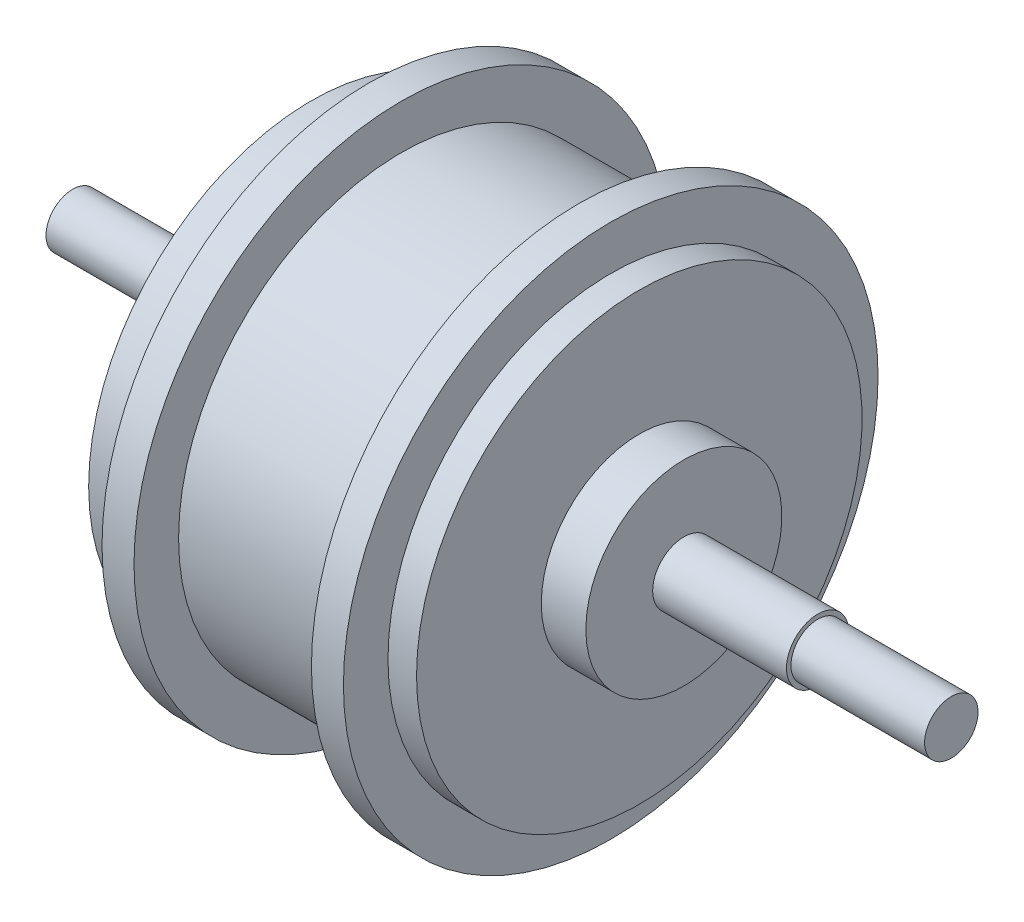
ISO-10303-21;
HEADER;
FILE_DESCRIPTION(('STEP AP214'),'2;1');
FILE_NAME('part.step','',(''),(''),'','','');
FILE_SCHEMA(('AUTOMOTIVE_DESIGN { 1 0 10303 214 1 1 1 1 }'));
ENDSEC;
DATA;
#1=APPLICATION_CONTEXT('core data for automotive mechanical design processes');
#2=APPLICATION_PROTOCOL_DEFINITION('international standard','automotive_design',2000,#1);
#3=PRODUCT_CONTEXT('',#1,'mechanical');
#4=PRODUCT('Part','Part','',(#3));
#5=PRODUCT_RELATED_PRODUCT_CATEGORY('part','',(#4));
#6=PRODUCT_DEFINITION_FORMATION('','',#4);
#7=PRODUCT_DEFINITION_CONTEXT('part definition',#1,'design');
#8=PRODUCT_DEFINITION('design','',#6,#7);
#9=PRODUCT_DEFINITION_SHAPE('','',#8);
#10=(LENGTH_UNIT() NAMED_UNIT(*) SI_UNIT(.MILLI.,.METRE.));
#11=(NAMED_UNIT(*) PLANE_ANGLE_UNIT() SI_UNIT($,.RADIAN.));
#12=(NAMED_UNIT(*) SI_UNIT($,.STERADIAN.) SOLID_ANGLE_UNIT());
#13=UNCERTAINTY_MEASURE_WITH_UNIT(LENGTH_MEASURE(1.E-05),#10,'distance_accuracy_value','');
#14=(GEOMETRIC_REPRESENTATION_CONTEXT(3) GLOBAL_UNCERTAINTY_ASSIGNED_CONTEXT((#13)) GLOBAL_UNIT_ASSIGNED_CONTEXT((#10,
#11,#12)) REPRESENTATION_CONTEXT('',''));
#15=CARTESIAN_POINT('',(0.,0.,0.));
#16=DIRECTION('',(0.,0.,1.));
#17=DIRECTION('',(1.,0.,0.));
#18=AXIS2_PLACEMENT_3D('',#15,#16,#17);
#19=CARTESIAN_POINT('',(0.,0.,0.));
#20=DIRECTION('',(1.,0.,0.));
#21=DIRECTION('',(0.,0.,-1.));
#22=AXIS2_PLACEMENT_3D('',#19,#20,#21);
#23=PLANE('',#22);
#24=CARTESIAN_POINT('',(0.,0.,0.));
#25=DIRECTION('',(-1.,0.,0.));
#26=DIRECTION('',(0.,0.,1.));
#27=AXIS2_PLACEMENT_3D('',#24,#25,#26);
#28=CIRCLE('',#27,6.);
#29=CARTESIAN_POINT('',(0.,0.,6.));
#30=VERTEX_POINT('',#29);
#31=EDGE_CURVE('E10',#30,#30,#28,.T.);
#32=ORIENTED_EDGE('',*,*,#31,.T.);
#33=EDGE_LOOP('',(#32));
#34=FACE_BOUND('',#33,.T.);
#35=ADVANCED_FACE('F31',(#34),#23,.F.);
#36=CARTESIAN_POINT('',(0.,0.,0.));
#37=DIRECTION('',(-1.,0.,0.));
#38=DIRECTION('',(0.,0.,1.));
#39=AXIS2_PLACEMENT_3D('',#36,#37,#38);
#40=CYLINDRICAL_SURFACE('',#39,6.);
#41=ORIENTED_EDGE('',*,*,#31,.F.);
#42=EDGE_LOOP('',(#41));
#43=FACE_BOUND('',#42,.T.);
#44=CARTESIAN_POINT('',(33.,0.,0.));
#45=DIRECTION('',(-1.,0.,0.));
#46=DIRECTION('',(0.,0.,1.));
#47=AXIS2_PLACEMENT_3D('',#44,#45,#46);
#48=CIRCLE('',#47,6.);
#49=CARTESIAN_POINT('',(33.,0.,6.));
#50=VERTEX_POINT('',#49);
#51=EDGE_CURVE('E37',#50,#50,#48,.T.);
#52=ORIENTED_EDGE('',*,*,#51,.T.);
#53=EDGE_LOOP('',(#52));
#54=FACE_BOUND('',#53,.T.);
#55=ADVANCED_FACE('F120',(#43,#54),#40,.T.);
#56=CARTESIAN_POINT('',(33.,6.,0.));
#57=DIRECTION('',(1.,0.,0.));
#58=DIRECTION('',(0.,0.,-1.));
#59=AXIS2_PLACEMENT_3D('',#56,#57,#58);
#60=PLANE('',#59);
#61=ORIENTED_EDGE('',*,*,#51,.F.);
#62=EDGE_LOOP('',(#61));
#63=FACE_BOUND('',#62,.T.);
#64=CARTESIAN_POINT('',(33.,0.,0.));
#65=DIRECTION('',(-1.,0.,0.));
#66=DIRECTION('',(0.,0.,1.));
#67=AXIS2_PLACEMENT_3D('',#64,#65,#66);
#68=CIRCLE('',#67,8.5);
#69=CARTESIAN_POINT('',(33.,0.,8.5));
#70=VERTEX_POINT('',#69);
#71=EDGE_CURVE('E41',#70,#70,#68,.T.);
#72=ORIENTED_EDGE('',*,*,#71,.T.);
#73=EDGE_LOOP('',(#72));
#74=FACE_BOUND('',#73,.T.);
#75=ADVANCED_FACE('F124',(#63,#74),#60,.F.);
#76=CARTESIAN_POINT('',(0.,0.,0.));
#77=DIRECTION('',(-1.,0.,0.));
#78=DIRECTION('',(0.,0.,1.));
#79=AXIS2_PLACEMENT_3D('',#76,#77,#78);
#80=CYLINDRICAL_SURFACE('',#79,8.5);
#81=ORIENTED_EDGE('',*,*,#71,.F.);
#82=EDGE_LOOP('',(#81));
#83=FACE_BOUND('',#82,.T.);
#84=CARTESIAN_POINT('',(43.5,0.,0.));
#85=DIRECTION('',(-1.,0.,0.));
#86=DIRECTION('',(0.,0.,1.));
#87=AXIS2_PLACEMENT_3D('',#84,#85,#86);
#88=CIRCLE('',#87,8.5);
#89=CARTESIAN_POINT('',(43.5,0.,8.5));
#90=VERTEX_POINT('',#89);
#91=EDGE_CURVE('E45',#90,#90,#88,.T.);
#92=ORIENTED_EDGE('',*,*,#91,.T.);
#93=EDGE_LOOP('',(#92));
#94=FACE_BOUND('',#93,.T.);
#95=ADVANCED_FACE('F129',(#83,#94),#80,.T.);
#96=CARTESIAN_POINT('',(43.5,8.5,0.));
#97=DIRECTION('',(1.,0.,0.));
#98=DIRECTION('',(0.,0.,-1.));
#99=AXIS2_PLACEMENT_3D('',#96,#97,#98);
#100=PLANE('',#99);
#101=ORIENTED_EDGE('',*,*,#91,.F.);
#102=EDGE_LOOP('',(#101));
#103=FACE_BOUND('',#102,.T.);
#104=CARTESIAN_POINT('',(43.5,0.,0.));
#105=DIRECTION('',(-1.,0.,0.));
#106=DIRECTION('',(0.,0.,1.));
#107=AXIS2_PLACEMENT_3D('',#104,#105,#106);
#108=CIRCLE('',#107,17.);
#109=CARTESIAN_POINT('',(43.5,0.,17.));
#110=VERTEX_POINT('',#109);
#111=EDGE_CURVE('E50',#110,#110,#108,.T.);
#112=ORIENTED_EDGE('',*,*,#111,.T.);
#113=EDGE_LOOP('',(#112));
#114=FACE_BOUND('',#113,.T.);
#115=ADVANCED_FACE('F135',(#103,#114),#100,.F.);
#116=CARTESIAN_POINT('',(0.,0.,0.));
#117=DIRECTION('',(-1.,0.,0.));
#118=DIRECTION('',(0.,0.,1.));
#119=AXIS2_PLACEMENT_3D('',#116,#117,#118);
#120=CYLINDRICAL_SURFACE('',#119,17.);
#121=ORIENTED_EDGE('',*,*,#111,.F.);
#122=EDGE_LOOP('',(#121));
#123=FACE_BOUND('',#122,.T.);
#124=CARTESIAN_POINT('',(49.8148080657307,0.,0.));
#125=DIRECTION('',(-1.,0.,0.));
#126=DIRECTION('',(0.,0.,1.));
#127=AXIS2_PLACEMENT_3D('',#124,#125,#126);
#128=CIRCLE('',#127,17.);
#129=CARTESIAN_POINT('',(49.8148080657307,0.,17.));
#130=VERTEX_POINT('',#129);
#131=EDGE_CURVE('E53',#130,#130,#128,.T.);
#132=ORIENTED_EDGE('',*,*,#131,.T.);
#133=EDGE_LOOP('',(#132));
#134=FACE_BOUND('',#133,.T.);
#135=ADVANCED_FACE('F139',(#123,#134),#120,.T.);
#136=CARTESIAN_POINT('',(49.8148080657307,17.,0.));
#137=DIRECTION('',(1.,0.,0.));
#138=DIRECTION('',(0.,0.,-1.));
#139=AXIS2_PLACEMENT_3D('',#136,#137,#138);
#140=PLANE('',#139);
#141=ORIENTED_EDGE('',*,*,#131,.F.);
#142=EDGE_LOOP('',(#141));
#143=FACE_BOUND('',#142,.T.);
#144=CARTESIAN_POINT('',(49.8148080657307,0.,0.));
#145=DIRECTION('',(-1.,0.,0.));
#146=DIRECTION('',(0.,0.,1.));
#147=AXIS2_PLACEMENT_3D('',#144,#145,#146);
#148=CIRCLE('',#147,36.3185583303819);
#149=CARTESIAN_POINT('',(49.8148080657307,0.,36.3185583303819));
#150=VERTEX_POINT('',#149);
#151=EDGE_CURVE('E56',#150,#150,#148,.T.);
#152=ORIENTED_EDGE('',*,*,#151,.T.);
#153=EDGE_LOOP('',(#152));
#154=FACE_BOUND('',#153,.T.);
#155=ADVANCED_FACE('F143',(#143,#154),#140,.F.);
#156=CARTESIAN_POINT('',(53.5689655172414,0.,0.));
#157=DIRECTION('',(1.,0.,0.));
#158=DIRECTION('',(0.,0.,-1.));
#159=AXIS2_PLACEMENT_3D('',#156,#157,#158);
#160=CONICAL_SURFACE('',#159,50.,1.30299006554119);
#161=ORIENTED_EDGE('',*,*,#151,.F.);
#162=EDGE_LOOP('',(#161));
#163=FACE_BOUND('',#162,.T.);
#164=CARTESIAN_POINT('',(53.5689655172414,0.,0.));
#165=DIRECTION('',(-1.,0.,0.));
#166=DIRECTION('',(0.,0.,1.));
#167=AXIS2_PLACEMENT_3D('',#164,#165,#166);
#168=CIRCLE('',#167,50.);
#169=CARTESIAN_POINT('',(53.5689655172414,0.,50.));
#170=VERTEX_POINT('',#169);
#171=EDGE_CURVE('E59',#170,#170,#168,.T.);
#172=ORIENTED_EDGE('',*,*,#171,.T.);
#173=EDGE_LOOP('',(#172));
#174=FACE_BOUND('',#173,.T.);
#175=ADVANCED_FACE('F147',(#163,#174),#160,.T.);
#176=CARTESIAN_POINT('',(0.,0.,0.));
#177=DIRECTION('',(-1.,0.,0.));
#178=DIRECTION('',(0.,0.,1.));
#179=AXIS2_PLACEMENT_3D('',#176,#177,#178);
#180=CYLINDRICAL_SURFACE('',#179,50.);
#181=ORIENTED_EDGE('',*,*,#171,.F.);
#182=EDGE_LOOP('',(#181));
#183=FACE_BOUND('',#182,.T.);
#184=CARTESIAN_POINT('',(66.5689655172414,0.,0.));
#185=DIRECTION('',(-1.,0.,0.));
#186=DIRECTION('',(0.,0.,1.));
#187=AXIS2_PLACEMENT_3D('',#184,#185,#186);
#188=CIRCLE('',#187,50.);
#189=CARTESIAN_POINT('',(66.5689655172414,0.,50.));
#190=VERTEX_POINT('',#189);
#191=EDGE_CURVE('E62',#190,#190,#188,.T.);
#192=ORIENTED_EDGE('',*,*,#191,.T.);
#193=EDGE_LOOP('',(#192));
#194=FACE_BOUND('',#193,.T.);
#195=ADVANCED_FACE('F151',(#183,#194),#180,.T.);
#196=CARTESIAN_POINT('',(66.5689655172414,50.,0.));
#197=DIRECTION('',(1.,0.,0.));
#198=DIRECTION('',(0.,0.,-1.));
#199=AXIS2_PLACEMENT_3D('',#196,#197,#198);
#200=PLANE('',#199);
#201=ORIENTED_EDGE('',*,*,#191,.F.);
#202=EDGE_LOOP('',(#201));
#203=FACE_BOUND('',#202,.T.);
#204=CARTESIAN_POINT('',(66.5689655172414,0.,0.));
#205=DIRECTION('',(-1.,0.,0.));
#206=DIRECTION('',(0.,0.,1.));
#207=AXIS2_PLACEMENT_3D('',#204,#205,#206);
#208=CIRCLE('',#207,60.);
#209=CARTESIAN_POINT('',(66.5689655172414,0.,60.));
#210=VERTEX_POINT('',#209);
#211=EDGE_CURVE('E65',#210,#210,#208,.T.);
#212=ORIENTED_EDGE('',*,*,#211,.T.);
#213=EDGE_LOOP('',(#212));
#214=FACE_BOUND('',#213,.T.);
#215=ADVANCED_FACE('F155',(#203,#214),#200,.F.);
#216=CARTESIAN_POINT('',(0.,0.,0.));
#217=DIRECTION('',(-1.,0.,0.));
#218=DIRECTION('',(0.,0.,1.));
#219=AXIS2_PLACEMENT_3D('',#216,#217,#218);
#220=CYLINDRICAL_SURFACE('',#219,60.);
#221=ORIENTED_EDGE('',*,*,#211,.F.);
#222=EDGE_LOOP('',(#221));
#223=FACE_BOUND('',#222,.T.);
#224=CARTESIAN_POINT('',(73.7510344827586,0.,0.));
#225=DIRECTION('',(-1.,0.,0.));
#226=DIRECTION('',(0.,0.,1.));
#227=AXIS2_PLACEMENT_3D('',#224,#225,#226);
#228=CIRCLE('',#227,60.);
#229=CARTESIAN_POINT('',(73.7510344827586,0.,60.));
#230=VERTEX_POINT('',#229);
#231=EDGE_CURVE('E68',#230,#230,#228,.T.);
#232=ORIENTED_EDGE('',*,*,#231,.T.);
#233=EDGE_LOOP('',(#232));
#234=FACE_BOUND('',#233,.T.);
#235=ADVANCED_FACE('F159',(#223,#234),#220,.T.);
#236=CARTESIAN_POINT('',(73.7510344827586,60.,0.));
#237=DIRECTION('',(-1.,0.,0.));
#238=DIRECTION('',(0.,0.,1.));
#239=AXIS2_PLACEMENT_3D('',#236,#237,#238);
#240=PLANE('',#239);
#241=ORIENTED_EDGE('',*,*,#231,.F.);
#242=EDGE_LOOP('',(#241));
#243=FACE_BOUND('',#242,.T.);
#244=CARTESIAN_POINT('',(73.7510344827586,0.,0.));
#245=DIRECTION('',(-1.,0.,0.));
#246=DIRECTION('',(0.,0.,1.));
#247=AXIS2_PLACEMENT_3D('',#244,#245,#246);
#248=CIRCLE('',#247,50.);
#249=CARTESIAN_POINT('',(73.7510344827586,0.,50.));
#250=VERTEX_POINT('',#249);
#251=EDGE_CURVE('E71',#250,#250,#248,.T.);
#252=ORIENTED_EDGE('',*,*,#251,.T.);
#253=EDGE_LOOP('',(#252));
#254=FACE_BOUND('',#253,.T.);
#255=ADVANCED_FACE('F163',(#243,#254),#240,.F.);
#256=CARTESIAN_POINT('',(0.,0.,0.));
#257=DIRECTION('',(-1.,0.,0.));
#258=DIRECTION('',(0.,0.,1.));
#259=AXIS2_PLACEMENT_3D('',#256,#257,#258);
#260=CYLINDRICAL_SURFACE('',#259,50.);
#261=ORIENTED_EDGE('',*,*,#251,.F.);
#262=EDGE_LOOP('',(#261));
#263=FACE_BOUND('',#262,.T.);
#264=CARTESIAN_POINT('',(113.568965517241,0.,0.));
#265=DIRECTION('',(-1.,0.,0.));
#266=DIRECTION('',(0.,0.,1.));
#267=AXIS2_PLACEMENT_3D('',#264,#265,#266);
#268=CIRCLE('',#267,50.);
#269=CARTESIAN_POINT('',(113.568965517241,0.,50.));
#270=VERTEX_POINT('',#269);
#271=EDGE_CURVE('E74',#270,#270,#268,.T.);
#272=ORIENTED_EDGE('',*,*,#271,.T.);
#273=EDGE_LOOP('',(#272));
#274=FACE_BOUND('',#273,.T.);
#275=ADVANCED_FACE('F167',(#263,#274),#260,.T.);
#276=CARTESIAN_POINT('',(113.568965517241,50.,0.));
#277=DIRECTION('',(1.,0.,0.));
#278=DIRECTION('',(0.,0.,-1.));
#279=AXIS2_PLACEMENT_3D('',#276,#277,#278);
#280=PLANE('',#279);
#281=ORIENTED_EDGE('',*,*,#271,.F.);
#282=EDGE_LOOP('',(#281));
#283=FACE_BOUND('',#282,.T.);
#284=CARTESIAN_POINT('',(113.568965517241,0.,0.));
#285=DIRECTION('',(-1.,0.,0.));
#286=DIRECTION('',(0.,0.,1.));
#287=AXIS2_PLACEMENT_3D('',#284,#285,#286);
#288=CIRCLE('',#287,60.);
#289=CARTESIAN_POINT('',(113.568965517241,0.,60.));
#290=VERTEX_POINT('',#289);
#291=EDGE_CURVE('E77',#290,#290,#288,.T.);
#292=ORIENTED_EDGE('',*,*,#291,.T.);
#293=EDGE_LOOP('',(#292));
#294=FACE_BOUND('',#293,.T.);
#295=ADVANCED_FACE('F171',(#283,#294),#280,.F.);
#296=CARTESIAN_POINT('',(0.,0.,0.));
#297=DIRECTION('',(-1.,0.,0.));
#298=DIRECTION('',(0.,0.,1.));
#299=AXIS2_PLACEMENT_3D('',#296,#297,#298);
#300=CYLINDRICAL_SURFACE('',#299,60.);
#301=ORIENTED_EDGE('',*,*,#291,.F.);
#302=EDGE_LOOP('',(#301));
#303=FACE_BOUND('',#302,.T.);
#304=CARTESIAN_POINT('',(120.751034482759,0.,0.));
#305=DIRECTION('',(-1.,0.,0.));
#306=DIRECTION('',(0.,0.,1.));
#307=AXIS2_PLACEMENT_3D('',#304,#305,#306);
#308=CIRCLE('',#307,60.);
#309=CARTESIAN_POINT('',(120.751034482759,0.,60.));
#310=VERTEX_POINT('',#309);
#311=EDGE_CURVE('E80',#310,#310,#308,.T.);
#312=ORIENTED_EDGE('',*,*,#311,.T.);
#313=EDGE_LOOP('',(#312));
#314=FACE_BOUND('',#313,.T.);
#315=ADVANCED_FACE('F175',(#303,#314),#300,.T.);
#316=CARTESIAN_POINT('',(120.751034482759,60.,0.));
#317=DIRECTION('',(-1.,0.,0.));
#318=DIRECTION('',(0.,0.,1.));
#319=AXIS2_PLACEMENT_3D('',#316,#317,#318);
#320=PLANE('',#319);
#321=ORIENTED_EDGE('',*,*,#311,.F.);
#322=EDGE_LOOP('',(#321));
#323=FACE_BOUND('',#322,.T.);
#324=CARTESIAN_POINT('',(120.751034482759,0.,0.));
#325=DIRECTION('',(-1.,0.,0.));
#326=DIRECTION('',(0.,0.,1.));
#327=AXIS2_PLACEMENT_3D('',#324,#325,#326);
#328=CIRCLE('',#327,50.);
#329=CARTESIAN_POINT('',(120.751034482759,0.,50.));
#330=VERTEX_POINT('',#329);
#331=EDGE_CURVE('E83',#330,#330,#328,.T.);
#332=ORIENTED_EDGE('',*,*,#331,.T.);
#333=EDGE_LOOP('',(#332));
#334=FACE_BOUND('',#333,.T.);
#335=ADVANCED_FACE('F179',(#323,#334),#320,.F.);
#336=CARTESIAN_POINT('',(0.,0.,0.));
#337=DIRECTION('',(-1.,0.,0.));
#338=DIRECTION('',(0.,0.,1.));
#339=AXIS2_PLACEMENT_3D('',#336,#337,#338);
#340=CYLINDRICAL_SURFACE('',#339,50.);
#341=ORIENTED_EDGE('',*,*,#331,.F.);
#342=EDGE_LOOP('',(#341));
#343=FACE_BOUND('',#342,.T.);
#344=CARTESIAN_POINT('',(127.16,0.,0.));
#345=DIRECTION('',(-1.,0.,0.));
#346=DIRECTION('',(0.,0.,1.));
#347=AXIS2_PLACEMENT_3D('',#344,#345,#346);
#348=CIRCLE('',#347,50.);
#349=CARTESIAN_POINT('',(127.16,0.,50.));
#350=VERTEX_POINT('',#349);
#351=EDGE_CURVE('E86',#350,#350,#348,.T.);
#352=ORIENTED_EDGE('',*,*,#351,.T.);
#353=EDGE_LOOP('',(#352));
#354=FACE_BOUND('',#353,.T.);
#355=ADVANCED_FACE('F183',(#343,#354),#340,.T.);
#356=CARTESIAN_POINT('',(127.16,50.,0.));
#357=DIRECTION('',(-1.,0.,0.));
#358=DIRECTION('',(0.,0.,1.));
#359=AXIS2_PLACEMENT_3D('',#356,#357,#358);
#360=PLANE('',#359);
#361=ORIENTED_EDGE('',*,*,#351,.F.);
#362=EDGE_LOOP('',(#361));
#363=FACE_BOUND('',#362,.T.);
#364=CARTESIAN_POINT('',(127.16,0.,0.));
#365=DIRECTION('',(-1.,0.,0.));
#366=DIRECTION('',(0.,0.,1.));
#367=AXIS2_PLACEMENT_3D('',#364,#365,#366);
#368=CIRCLE('',#367,22.);
#369=CARTESIAN_POINT('',(127.16,0.,22.));
#370=VERTEX_POINT('',#369);
#371=EDGE_CURVE('E89',#370,#370,#368,.T.);
#372=ORIENTED_EDGE('',*,*,#371,.T.);
#373=EDGE_LOOP('',(#372));
#374=FACE_BOUND('',#373,.T.);
#375=ADVANCED_FACE('F187',(#363,#374),#360,.F.);
#376=CARTESIAN_POINT('',(0.,0.,0.));
#377=DIRECTION('',(-1.,0.,0.));
#378=DIRECTION('',(0.,0.,1.));
#379=AXIS2_PLACEMENT_3D('',#376,#377,#378);
#380=CYLINDRICAL_SURFACE('',#379,22.);
#381=ORIENTED_EDGE('',*,*,#371,.F.);
#382=EDGE_LOOP('',(#381));
#383=FACE_BOUND('',#382,.T.);
#384=CARTESIAN_POINT('',(137.16,0.,0.));
#385=DIRECTION('',(-1.,0.,0.));
#386=DIRECTION('',(0.,0.,1.));
#387=AXIS2_PLACEMENT_3D('',#384,#385,#386);
#388=CIRCLE('',#387,22.);
#389=CARTESIAN_POINT('',(137.16,0.,22.));
#390=VERTEX_POINT('',#389);
#391=EDGE_CURVE('E92',#390,#390,#388,.T.);
#392=ORIENTED_EDGE('',*,*,#391,.T.);
#393=EDGE_LOOP('',(#392));
#394=FACE_BOUND('',#393,.T.);
#395=ADVANCED_FACE('F191',(#383,#394),#380,.T.);
#396=CARTESIAN_POINT('',(137.16,22.,0.));
#397=DIRECTION('',(-1.,0.,0.));
#398=DIRECTION('',(0.,0.,1.));
#399=AXIS2_PLACEMENT_3D('',#396,#397,#398);
#400=PLANE('',#399);
#401=ORIENTED_EDGE('',*,*,#391,.F.);
#402=EDGE_LOOP('',(#401));
#403=FACE_BOUND('',#402,.T.);
#404=CARTESIAN_POINT('',(137.16,0.,0.));
#405=DIRECTION('',(-1.,0.,0.));
#406=DIRECTION('',(0.,0.,1.));
#407=AXIS2_PLACEMENT_3D('',#404,#405,#406);
#408=CIRCLE('',#407,6.99999999999999);
#409=CARTESIAN_POINT('',(137.16,0.,6.99999999999999));
#410=VERTEX_POINT('',#409);
#411=EDGE_CURVE('E95',#410,#410,#408,.T.);
#412=ORIENTED_EDGE('',*,*,#411,.T.);
#413=EDGE_LOOP('',(#412));
#414=FACE_BOUND('',#413,.T.);
#415=ADVANCED_FACE('F195',(#403,#414),#400,.F.);
#416=CARTESIAN_POINT('',(0.,0.,0.));
#417=DIRECTION('',(-1.,0.,0.));
#418=DIRECTION('',(0.,0.,1.));
#419=AXIS2_PLACEMENT_3D('',#416,#417,#418);
#420=CYLINDRICAL_SURFACE('',#419,6.99999999999999);
#421=ORIENTED_EDGE('',*,*,#411,.F.);
#422=EDGE_LOOP('',(#421));
#423=FACE_BOUND('',#422,.T.);
#424=CARTESIAN_POINT('',(167.191616727723,0.,0.));
#425=DIRECTION('',(-1.,0.,0.));
#426=DIRECTION('',(0.,0.,1.));
#427=AXIS2_PLACEMENT_3D('',#424,#425,#426);
#428=CIRCLE('',#427,6.99999999999999);
#429=CARTESIAN_POINT('',(167.191616727723,0.,6.99999999999999));
#430=VERTEX_POINT('',#429);
#431=EDGE_CURVE('E98',#430,#430,#428,.T.);
#432=ORIENTED_EDGE('',*,*,#431,.T.);
#433=EDGE_LOOP('',(#432));
#434=FACE_BOUND('',#433,.T.);
#435=ADVANCED_FACE('F199',(#423,#434),#420,.T.);
#436=CARTESIAN_POINT('',(167.191616727723,6.99999999999999,0.));
#437=DIRECTION('',(-1.,0.,0.));
#438=DIRECTION('',(0.,0.,1.));
#439=AXIS2_PLACEMENT_3D('',#436,#437,#438);
#440=PLANE('',#439);
#441=ORIENTED_EDGE('',*,*,#431,.F.);
#442=EDGE_LOOP('',(#441));
#443=FACE_BOUND('',#442,.T.);
#444=CARTESIAN_POINT('',(167.191616727723,0.,0.));
#445=DIRECTION('',(-1.,0.,0.));
#446=DIRECTION('',(0.,0.,1.));
#447=AXIS2_PLACEMENT_3D('',#444,#445,#446);
#448=CIRCLE('',#447,6.);
#449=CARTESIAN_POINT('',(167.191616727723,0.,6.));
#450=VERTEX_POINT('',#449);
#451=EDGE_CURVE('E101',#450,#450,#448,.T.);
#452=ORIENTED_EDGE('',*,*,#451,.T.);
#453=EDGE_LOOP('',(#452));
#454=FACE_BOUND('',#453,.T.);
#455=ADVANCED_FACE('F116',(#443,#454),#440,.F.);
#456=CARTESIAN_POINT('',(0.,0.,0.));
#457=DIRECTION('',(-1.,0.,0.));
#458=DIRECTION('',(0.,0.,1.));
#459=AXIS2_PLACEMENT_3D('',#456,#457,#458);
#460=CYLINDRICAL_SURFACE('',#459,6.);
#461=ORIENTED_EDGE('',*,*,#451,.F.);
#462=EDGE_LOOP('',(#461));
#463=FACE_BOUND('',#462,.T.);
#464=CARTESIAN_POINT('',(197.191616727723,0.,0.));
#465=DIRECTION('',(-1.,0.,0.));
#466=DIRECTION('',(0.,0.,1.));
#467=AXIS2_PLACEMENT_3D('',#464,#465,#466);
#468=CIRCLE('',#467,6.);
#469=CARTESIAN_POINT('',(197.191616727723,0.,6.));
#470=VERTEX_POINT('',#469);
#471=EDGE_CURVE('E104',#470,#470,#468,.T.);
#472=ORIENTED_EDGE('',*,*,#471,.T.);
#473=EDGE_LOOP('',(#472));
#474=FACE_BOUND('',#473,.T.);
#475=ADVANCED_FACE('F108',(#463,#474),#460,.T.);
#476=CARTESIAN_POINT('',(197.191616727723,6.,0.));
#477=DIRECTION('',(-1.,0.,0.));
#478=DIRECTION('',(0.,0.,1.));
#479=AXIS2_PLACEMENT_3D('',#476,#477,#478);
#480=PLANE('',#479);
#481=ORIENTED_EDGE('',*,*,#471,.F.);
#482=EDGE_LOOP('',(#481));
#483=FACE_BOUND('',#482,.T.);
#484=ADVANCED_FACE('F110',(#483),#480,.F.);
#485=CLOSED_SHELL('',(#35,#55,#75,#95,#115,#135,#155,#175,#195,#215,#235,#255,#275,#295,#315,
#335,#355,#375,#395,#415,#435,#455,#475,#484));
#486=MANIFOLD_SOLID_BREP('B2',#485);
#487=ADVANCED_BREP_SHAPE_REPRESENTATION('',(#18,#486),#14);
#488=SHAPE_DEFINITION_REPRESENTATION(#9,#487);
ENDSEC;
END-ISO-10303-21;
